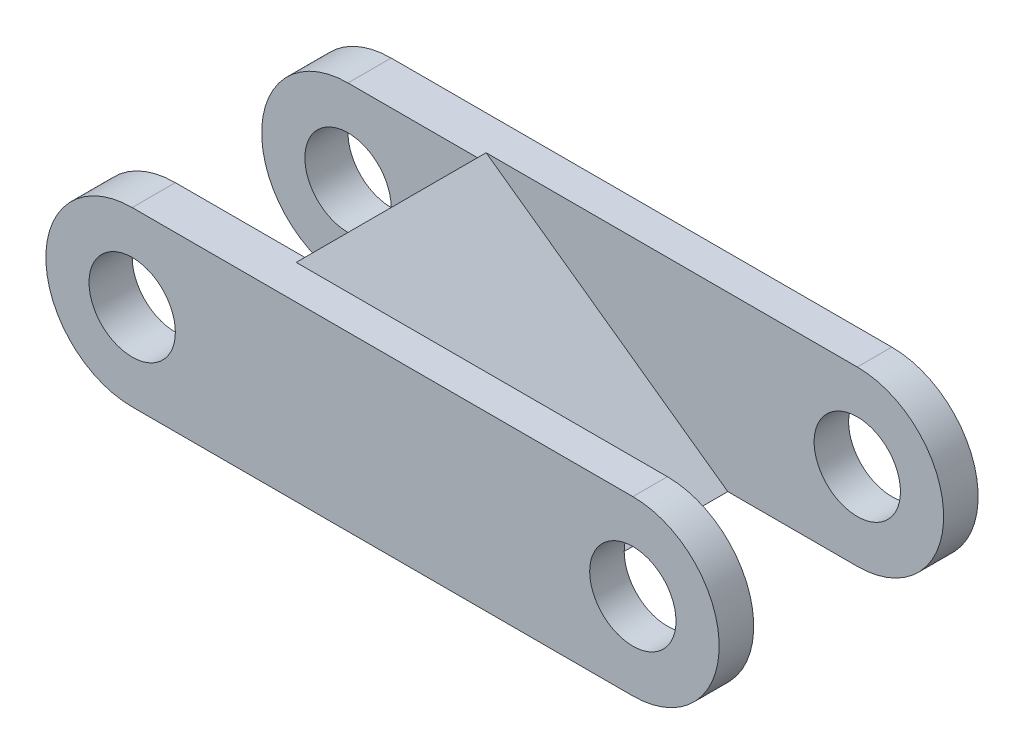
ISO-10303-21;
HEADER;
FILE_DESCRIPTION(('STEP AP214'),'2;1');
FILE_NAME('part.step','',(''),(''),'','','');
FILE_SCHEMA(('AUTOMOTIVE_DESIGN { 1 0 10303 214 1 1 1 1 }'));
ENDSEC;
DATA;
#1=APPLICATION_CONTEXT('core data for automotive mechanical design processes');
#2=APPLICATION_PROTOCOL_DEFINITION('international standard','automotive_design',2000,#1);
#3=PRODUCT_CONTEXT('',#1,'mechanical');
#4=PRODUCT('Part','Part','',(#3));
#5=PRODUCT_RELATED_PRODUCT_CATEGORY('part','',(#4));
#6=PRODUCT_DEFINITION_FORMATION('','',#4);
#7=PRODUCT_DEFINITION_CONTEXT('part definition',#1,'design');
#8=PRODUCT_DEFINITION('design','',#6,#7);
#9=PRODUCT_DEFINITION_SHAPE('','',#8);
#10=(LENGTH_UNIT() NAMED_UNIT(*) SI_UNIT(.MILLI.,.METRE.));
#11=(NAMED_UNIT(*) PLANE_ANGLE_UNIT() SI_UNIT($,.RADIAN.));
#12=(NAMED_UNIT(*) SI_UNIT($,.STERADIAN.) SOLID_ANGLE_UNIT());
#13=UNCERTAINTY_MEASURE_WITH_UNIT(LENGTH_MEASURE(1.E-05),#10,'distance_accuracy_value','');
#14=(GEOMETRIC_REPRESENTATION_CONTEXT(3) GLOBAL_UNCERTAINTY_ASSIGNED_CONTEXT((#13)) GLOBAL_UNIT_ASSIGNED_CONTEXT((#10,
#11,#12)) REPRESENTATION_CONTEXT('',''));
#15=CARTESIAN_POINT('',(0.,0.,0.));
#16=DIRECTION('',(0.,0.,1.));
#17=DIRECTION('',(1.,0.,0.));
#18=AXIS2_PLACEMENT_3D('',#15,#16,#17);
#19=CARTESIAN_POINT('',(0.,10.,-30.));
#20=DIRECTION('',(0.,-1.,0.));
#21=DIRECTION('',(0.,0.,1.));
#22=AXIS2_PLACEMENT_3D('',#19,#20,#21);
#23=PLANE('',#22);
#24=DIRECTION('',(0.,0.,-1.));
#25=VECTOR('',#24,1.);
#26=CARTESIAN_POINT('',(15.,10.,30.404313133584));
#27=LINE('',#26,#25);
#28=CARTESIAN_POINT('',(15.,10.,-4.));
#29=VERTEX_POINT('',#28);
#30=CARTESIAN_POINT('',(15.,10.,-5.));
#31=VERTEX_POINT('',#30);
#32=EDGE_CURVE('E166',#29,#31,#27,.T.);
#33=ORIENTED_EDGE('',*,*,#32,.T.);
#34=DIRECTION('',(-1.,0.,0.));
#35=VECTOR('',#34,1.);
#36=CARTESIAN_POINT('',(15.,10.,-5.));
#37=LINE('',#36,#35);
#38=CARTESIAN_POINT('',(0.,10.,-5.));
#39=VERTEX_POINT('',#38);
#40=EDGE_CURVE('E237',#31,#39,#37,.T.);
#41=ORIENTED_EDGE('',*,*,#40,.T.);
#42=DIRECTION('',(0.,0.,1.));
#43=VECTOR('',#42,1.);
#44=CARTESIAN_POINT('',(0.,10.,-30.));
#45=LINE('',#44,#43);
#46=CARTESIAN_POINT('',(0.,10.,0.));
#47=VERTEX_POINT('',#46);
#48=EDGE_CURVE('E203',#39,#47,#45,.T.);
#49=ORIENTED_EDGE('',*,*,#48,.T.);
#50=DIRECTION('',(-1.,0.,0.));
#51=VECTOR('',#50,1.);
#52=CARTESIAN_POINT('',(0.,10.,0.));
#53=LINE('',#52,#51);
#54=CARTESIAN_POINT('',(57.9938700824609,10.,0.));
#55=VERTEX_POINT('',#54);
#56=EDGE_CURVE('E197',#55,#47,#53,.T.);
#57=ORIENTED_EDGE('',*,*,#56,.F.);
#58=DIRECTION('',(0.,0.,1.));
#59=VECTOR('',#58,1.);
#60=CARTESIAN_POINT('',(57.9938700824609,10.,-30.));
#61=LINE('',#60,#59);
#62=CARTESIAN_POINT('',(57.9938700824609,10.,-4.));
#63=VERTEX_POINT('',#62);
#64=EDGE_CURVE('E212',#63,#55,#61,.T.);
#65=ORIENTED_EDGE('',*,*,#64,.F.);
#66=DIRECTION('',(-1.,0.,0.));
#67=VECTOR('',#66,1.);
#68=CARTESIAN_POINT('',(42.9938700824609,10.,-4.));
#69=LINE('',#68,#67);
#70=EDGE_CURVE('E156',#63,#29,#69,.T.);
#71=ORIENTED_EDGE('',*,*,#70,.T.);
#72=EDGE_LOOP('',(#33,#41,#49,#57,#65,#71));
#73=FACE_BOUND('',#72,.T.);
#74=ADVANCED_FACE('F37',(#73),#23,.F.);
#75=CARTESIAN_POINT('',(0.,0.,-30.));
#76=DIRECTION('',(0.,0.,1.));
#77=DIRECTION('',(-1.,0.,0.));
#78=AXIS2_PLACEMENT_3D('',#75,#76,#77);
#79=CYLINDRICAL_SURFACE('',#78,10.);
#80=CARTESIAN_POINT('',(0.,10.,-30.));
#81=VERTEX_POINT('',#80);
#82=CARTESIAN_POINT('',(0.,10.,-25.));
#83=VERTEX_POINT('',#82);
#84=EDGE_CURVE('E210',#81,#83,#45,.T.);
#85=ORIENTED_EDGE('',*,*,#84,.F.);
#86=CARTESIAN_POINT('',(0.,0.,-30.));
#87=DIRECTION('',(0.,0.,1.));
#88=DIRECTION('',(1.,0.,0.));
#89=AXIS2_PLACEMENT_3D('',#86,#87,#88);
#90=CIRCLE('',#89,10.);
#91=CARTESIAN_POINT('',(0.,-10.,-30.));
#92=VERTEX_POINT('',#91);
#93=EDGE_CURVE('E194',#81,#92,#90,.T.);
#94=ORIENTED_EDGE('',*,*,#93,.T.);
#95=DIRECTION('',(0.,0.,1.));
#96=VECTOR('',#95,1.);
#97=CARTESIAN_POINT('',(0.,-10.,-30.));
#98=LINE('',#97,#96);
#99=CARTESIAN_POINT('',(0.,-10.,-25.));
#100=VERTEX_POINT('',#99);
#101=EDGE_CURVE('E11',#92,#100,#98,.T.);
#102=ORIENTED_EDGE('',*,*,#101,.T.);
#103=CARTESIAN_POINT('',(0.,0.,-25.));
#104=DIRECTION('',(0.,0.,1.));
#105=DIRECTION('',(1.,0.,0.));
#106=AXIS2_PLACEMENT_3D('',#103,#104,#105);
#107=CIRCLE('',#106,10.);
#108=EDGE_CURVE('E179',#83,#100,#107,.T.);
#109=ORIENTED_EDGE('',*,*,#108,.F.);
#110=EDGE_LOOP('',(#85,#94,#102,#109));
#111=FACE_BOUND('',#110,.T.);
#112=ADVANCED_FACE('F270',(#111),#79,.T.);
#113=CARTESIAN_POINT('',(57.9938700824609,0.,-30.));
#114=DIRECTION('',(0.,0.,1.));
#115=DIRECTION('',(-1.,0.,0.));
#116=AXIS2_PLACEMENT_3D('',#113,#114,#115);
#117=CYLINDRICAL_SURFACE('',#116,10.);
#118=ORIENTED_EDGE('',*,*,#64,.T.);
#119=CARTESIAN_POINT('',(57.9938700824609,0.,0.));
#120=DIRECTION('',(0.,0.,1.));
#121=DIRECTION('',(1.,0.,0.));
#122=AXIS2_PLACEMENT_3D('',#119,#120,#121);
#123=CIRCLE('',#122,10.);
#124=CARTESIAN_POINT('',(57.9938700824609,-10.,0.));
#125=VERTEX_POINT('',#124);
#126=EDGE_CURVE('E207',#125,#55,#123,.T.);
#127=ORIENTED_EDGE('',*,*,#126,.F.);
#128=DIRECTION('',(0.,0.,1.));
#129=VECTOR('',#128,1.);
#130=CARTESIAN_POINT('',(57.9938700824609,-10.,-30.));
#131=LINE('',#130,#129);
#132=CARTESIAN_POINT('',(57.9938700824609,-10.,-4.));
#133=VERTEX_POINT('',#132);
#134=EDGE_CURVE('E216',#133,#125,#131,.T.);
#135=ORIENTED_EDGE('',*,*,#134,.F.);
#136=CARTESIAN_POINT('',(57.9938700824609,0.,-4.));
#137=DIRECTION('',(0.,0.,-1.));
#138=DIRECTION('',(-1.,0.,0.));
#139=AXIS2_PLACEMENT_3D('',#136,#137,#138);
#140=CIRCLE('',#139,10.);
#141=EDGE_CURVE('E173',#63,#133,#140,.T.);
#142=ORIENTED_EDGE('',*,*,#141,.F.);
#143=EDGE_LOOP('',(#118,#127,#135,#142));
#144=FACE_BOUND('',#143,.T.);
#145=ADVANCED_FACE('F283',(#144),#117,.T.);
#146=CARTESIAN_POINT('',(0.,0.,-30.));
#147=DIRECTION('',(0.,0.,1.));
#148=DIRECTION('',(-1.,0.,0.));
#149=AXIS2_PLACEMENT_3D('',#146,#147,#148);
#150=CYLINDRICAL_SURFACE('',#149,5.);
#151=CARTESIAN_POINT('',(0.,0.,-25.));
#152=DIRECTION('',(0.,0.,1.));
#153=DIRECTION('',(1.,0.,0.));
#154=AXIS2_PLACEMENT_3D('',#151,#152,#153);
#155=CIRCLE('',#154,5.);
#156=CARTESIAN_POINT('',(5.,0.,-25.));
#157=VERTEX_POINT('',#156);
#158=EDGE_CURVE('E41',#157,#157,#155,.T.);
#159=ORIENTED_EDGE('',*,*,#158,.T.);
#160=EDGE_LOOP('',(#159));
#161=FACE_BOUND('',#160,.T.);
#162=CARTESIAN_POINT('',(0.,0.,-30.));
#163=DIRECTION('',(0.,0.,1.));
#164=DIRECTION('',(1.,0.,0.));
#165=AXIS2_PLACEMENT_3D('',#162,#163,#164);
#166=CIRCLE('',#165,5.);
#167=CARTESIAN_POINT('',(5.,0.,-30.));
#168=VERTEX_POINT('',#167);
#169=EDGE_CURVE('E189',#168,#168,#166,.T.);
#170=ORIENTED_EDGE('',*,*,#169,.F.);
#171=EDGE_LOOP('',(#170));
#172=FACE_BOUND('',#171,.T.);
#173=ADVANCED_FACE('F294',(#161,#172),#150,.F.);
#174=CARTESIAN_POINT('',(57.9938700824609,0.,-30.));
#175=DIRECTION('',(0.,0.,1.));
#176=DIRECTION('',(-1.,0.,0.));
#177=AXIS2_PLACEMENT_3D('',#174,#175,#176);
#178=CYLINDRICAL_SURFACE('',#177,5.);
#179=CARTESIAN_POINT('',(57.9938700824609,0.,-4.));
#180=DIRECTION('',(0.,0.,-1.));
#181=DIRECTION('',(-1.,0.,0.));
#182=AXIS2_PLACEMENT_3D('',#179,#180,#181);
#183=CIRCLE('',#182,5.);
#184=CARTESIAN_POINT('',(52.9938700824609,0.,-4.));
#185=VERTEX_POINT('',#184);
#186=EDGE_CURVE('E171',#185,#185,#183,.T.);
#187=ORIENTED_EDGE('',*,*,#186,.T.);
#188=EDGE_LOOP('',(#187));
#189=FACE_BOUND('',#188,.T.);
#190=CARTESIAN_POINT('',(57.9938700824609,0.,0.));
#191=DIRECTION('',(0.,0.,1.));
#192=DIRECTION('',(1.,0.,0.));
#193=AXIS2_PLACEMENT_3D('',#190,#191,#192);
#194=CIRCLE('',#193,5.);
#195=CARTESIAN_POINT('',(62.9938700824609,0.,0.));
#196=VERTEX_POINT('',#195);
#197=EDGE_CURVE('E182',#196,#196,#194,.T.);
#198=ORIENTED_EDGE('',*,*,#197,.T.);
#199=EDGE_LOOP('',(#198));
#200=FACE_BOUND('',#199,.T.);
#201=ADVANCED_FACE('F304',(#189,#200),#178,.F.);
#202=CARTESIAN_POINT('',(0.,0.,-30.));
#203=DIRECTION('',(0.,0.,-1.));
#204=DIRECTION('',(1.,0.,0.));
#205=AXIS2_PLACEMENT_3D('',#202,#203,#204);
#206=PLANE('',#205);
#207=ORIENTED_EDGE('',*,*,#169,.T.);
#208=EDGE_LOOP('',(#207));
#209=FACE_BOUND('',#208,.T.);
#210=ORIENTED_EDGE('',*,*,#93,.F.);
#211=DIRECTION('',(-1.,0.,0.));
#212=VECTOR('',#211,1.);
#213=CARTESIAN_POINT('',(0.,10.,-30.));
#214=LINE('',#213,#212);
#215=CARTESIAN_POINT('',(57.9938700824609,10.,-30.));
#216=VERTEX_POINT('',#215);
#217=EDGE_CURVE('E63',#216,#81,#214,.T.);
#218=ORIENTED_EDGE('',*,*,#217,.F.);
#219=CARTESIAN_POINT('',(57.9938700824609,0.,-30.));
#220=DIRECTION('',(0.,0.,1.));
#221=DIRECTION('',(1.,0.,0.));
#222=AXIS2_PLACEMENT_3D('',#219,#220,#221);
#223=CIRCLE('',#222,10.);
#224=CARTESIAN_POINT('',(57.9938700824609,-10.,-30.));
#225=VERTEX_POINT('',#224);
#226=EDGE_CURVE('E199',#225,#216,#223,.T.);
#227=ORIENTED_EDGE('',*,*,#226,.F.);
#228=DIRECTION('',(1.,0.,0.));
#229=VECTOR('',#228,1.);
#230=CARTESIAN_POINT('',(0.,-10.,-30.));
#231=LINE('',#230,#229);
#232=EDGE_CURVE('E91',#92,#225,#231,.T.);
#233=ORIENTED_EDGE('',*,*,#232,.F.);
#234=EDGE_LOOP('',(#210,#218,#227,#233));
#235=FACE_BOUND('',#234,.T.);
#236=CARTESIAN_POINT('',(57.9938700824609,0.,-30.));
#237=DIRECTION('',(0.,0.,1.));
#238=DIRECTION('',(1.,0.,0.));
#239=AXIS2_PLACEMENT_3D('',#236,#237,#238);
#240=CIRCLE('',#239,5.);
#241=CARTESIAN_POINT('',(62.9938700824609,0.,-30.));
#242=VERTEX_POINT('',#241);
#243=EDGE_CURVE('E183',#242,#242,#240,.T.);
#244=ORIENTED_EDGE('',*,*,#243,.T.);
#245=EDGE_LOOP('',(#244));
#246=FACE_BOUND('',#245,.T.);
#247=ADVANCED_FACE('F330',(#209,#235,#246),#206,.T.);
#248=CARTESIAN_POINT('',(0.,0.,0.));
#249=DIRECTION('',(0.,0.,-1.));
#250=DIRECTION('',(1.,0.,0.));
#251=AXIS2_PLACEMENT_3D('',#248,#249,#250);
#252=PLANE('',#251);
#253=CARTESIAN_POINT('',(0.,0.,0.));
#254=DIRECTION('',(0.,0.,1.));
#255=DIRECTION('',(1.,0.,0.));
#256=AXIS2_PLACEMENT_3D('',#253,#254,#255);
#257=CIRCLE('',#256,10.);
#258=CARTESIAN_POINT('',(0.,-10.,0.));
#259=VERTEX_POINT('',#258);
#260=EDGE_CURVE('E84',#47,#259,#257,.T.);
#261=ORIENTED_EDGE('',*,*,#260,.T.);
#262=DIRECTION('',(1.,0.,0.));
#263=VECTOR('',#262,1.);
#264=CARTESIAN_POINT('',(0.,-10.,0.));
#265=LINE('',#264,#263);
#266=EDGE_CURVE('E205',#259,#125,#265,.T.);
#267=ORIENTED_EDGE('',*,*,#266,.T.);
#268=ORIENTED_EDGE('',*,*,#126,.T.);
#269=ORIENTED_EDGE('',*,*,#56,.T.);
#270=EDGE_LOOP('',(#261,#267,#268,#269));
#271=FACE_BOUND('',#270,.T.);
#272=CARTESIAN_POINT('',(0.,0.,0.));
#273=DIRECTION('',(0.,0.,1.));
#274=DIRECTION('',(1.,0.,0.));
#275=AXIS2_PLACEMENT_3D('',#272,#273,#274);
#276=CIRCLE('',#275,5.);
#277=CARTESIAN_POINT('',(5.,0.,0.));
#278=VERTEX_POINT('',#277);
#279=EDGE_CURVE('E186',#278,#278,#276,.T.);
#280=ORIENTED_EDGE('',*,*,#279,.F.);
#281=EDGE_LOOP('',(#280));
#282=FACE_BOUND('',#281,.T.);
#283=ORIENTED_EDGE('',*,*,#197,.F.);
#284=EDGE_LOOP('',(#283));
#285=FACE_BOUND('',#284,.T.);
#286=ADVANCED_FACE('F312',(#271,#282,#285),#252,.F.);
#287=CARTESIAN_POINT('',(0.,0.,-5.));
#288=DIRECTION('',(0.,0.,-1.));
#289=DIRECTION('',(-1.,0.,0.));
#290=AXIS2_PLACEMENT_3D('',#287,#288,#289);
#291=CIRCLE('',#290,10.);
#292=CARTESIAN_POINT('',(0.,-10.,-5.));
#293=VERTEX_POINT('',#292);
#294=EDGE_CURVE('E177',#293,#39,#291,.T.);
#295=ORIENTED_EDGE('',*,*,#294,.F.);
#296=EDGE_CURVE('E46',#293,#259,#98,.T.);
#297=ORIENTED_EDGE('',*,*,#296,.T.);
#298=ORIENTED_EDGE('',*,*,#260,.F.);
#299=ORIENTED_EDGE('',*,*,#48,.F.);
#300=EDGE_LOOP('',(#295,#297,#298,#299));
#301=FACE_BOUND('',#300,.T.);
#302=ADVANCED_FACE('F39',(#301),#79,.T.);
#303=CARTESIAN_POINT('',(0.,-10.,-30.));
#304=DIRECTION('',(0.,1.,0.));
#305=DIRECTION('',(0.,0.,-1.));
#306=AXIS2_PLACEMENT_3D('',#303,#304,#305);
#307=PLANE('',#306);
#308=ORIENTED_EDGE('',*,*,#101,.F.);
#309=ORIENTED_EDGE('',*,*,#232,.T.);
#310=CARTESIAN_POINT('',(57.9938700824609,-10.,-26.));
#311=VERTEX_POINT('',#310);
#312=EDGE_CURVE('E159',#225,#311,#131,.T.);
#313=ORIENTED_EDGE('',*,*,#312,.T.);
#314=DIRECTION('',(1.,0.,0.));
#315=VECTOR('',#314,1.);
#316=CARTESIAN_POINT('',(42.9938700824609,-10.,-26.));
#317=LINE('',#316,#315);
#318=CARTESIAN_POINT('',(42.9938700824609,-10.,-26.));
#319=VERTEX_POINT('',#318);
#320=EDGE_CURVE('E145',#319,#311,#317,.T.);
#321=ORIENTED_EDGE('',*,*,#320,.F.);
#322=DIRECTION('',(0.,0.,-1.));
#323=VECTOR('',#322,1.);
#324=CARTESIAN_POINT('',(42.9938700824609,-10.,-26.));
#325=LINE('',#324,#323);
#326=CARTESIAN_POINT('',(42.9938700824609,-10.,-4.));
#327=VERTEX_POINT('',#326);
#328=EDGE_CURVE('E152',#327,#319,#325,.T.);
#329=ORIENTED_EDGE('',*,*,#328,.F.);
#330=DIRECTION('',(-1.,0.,0.));
#331=VECTOR('',#330,1.);
#332=CARTESIAN_POINT('',(42.9938700824609,-10.,-4.));
#333=LINE('',#332,#331);
#334=EDGE_CURVE('E160',#133,#327,#333,.T.);
#335=ORIENTED_EDGE('',*,*,#334,.F.);
#336=ORIENTED_EDGE('',*,*,#134,.T.);
#337=ORIENTED_EDGE('',*,*,#266,.F.);
#338=ORIENTED_EDGE('',*,*,#296,.F.);
#339=DIRECTION('',(-1.,0.,0.));
#340=VECTOR('',#339,1.);
#341=CARTESIAN_POINT('',(15.,-10.,-5.));
#342=LINE('',#341,#340);
#343=CARTESIAN_POINT('',(15.,-10.,-5.));
#344=VERTEX_POINT('',#343);
#345=EDGE_CURVE('E240',#344,#293,#342,.T.);
#346=ORIENTED_EDGE('',*,*,#345,.F.);
#347=DIRECTION('',(0.,0.,1.));
#348=VECTOR('',#347,1.);
#349=CARTESIAN_POINT('',(15.,-10.,-5.));
#350=LINE('',#349,#348);
#351=CARTESIAN_POINT('',(15.,-10.,-25.));
#352=VERTEX_POINT('',#351);
#353=EDGE_CURVE('E248',#352,#344,#350,.T.);
#354=ORIENTED_EDGE('',*,*,#353,.F.);
#355=DIRECTION('',(1.,0.,0.));
#356=VECTOR('',#355,1.);
#357=CARTESIAN_POINT('',(15.,-10.,-25.));
#358=LINE('',#357,#356);
#359=EDGE_CURVE('E255',#100,#352,#358,.T.);
#360=ORIENTED_EDGE('',*,*,#359,.F.);
#361=EDGE_LOOP('',(#308,#309,#313,#321,#329,#335,#336,#337,#338,#346,#354,#360));
#362=FACE_BOUND('',#361,.T.);
#363=ADVANCED_FACE('F158',(#362),#307,.F.);
#364=CARTESIAN_POINT('',(57.9938700824609,0.,-26.));
#365=DIRECTION('',(0.,0.,1.));
#366=DIRECTION('',(1.,0.,0.));
#367=AXIS2_PLACEMENT_3D('',#364,#365,#366);
#368=CIRCLE('',#367,10.);
#369=CARTESIAN_POINT('',(57.9938700824609,10.,-26.));
#370=VERTEX_POINT('',#369);
#371=EDGE_CURVE('E169',#311,#370,#368,.T.);
#372=ORIENTED_EDGE('',*,*,#371,.F.);
#373=ORIENTED_EDGE('',*,*,#312,.F.);
#374=ORIENTED_EDGE('',*,*,#226,.T.);
#375=EDGE_CURVE('E213',#216,#370,#61,.T.);
#376=ORIENTED_EDGE('',*,*,#375,.T.);
#377=EDGE_LOOP('',(#372,#373,#374,#376));
#378=FACE_BOUND('',#377,.T.);
#379=ADVANCED_FACE('F287',(#378),#117,.T.);
#380=DIRECTION('',(1.,0.,0.));
#381=VECTOR('',#380,1.);
#382=CARTESIAN_POINT('',(42.9938700824609,10.,-26.));
#383=LINE('',#382,#381);
#384=CARTESIAN_POINT('',(15.,10.,-26.));
#385=VERTEX_POINT('',#384);
#386=EDGE_CURVE('E147',#385,#370,#383,.T.);
#387=ORIENTED_EDGE('',*,*,#386,.T.);
#388=ORIENTED_EDGE('',*,*,#375,.F.);
#389=ORIENTED_EDGE('',*,*,#217,.T.);
#390=ORIENTED_EDGE('',*,*,#84,.T.);
#391=DIRECTION('',(1.,0.,0.));
#392=VECTOR('',#391,1.);
#393=CARTESIAN_POINT('',(15.,10.,-25.));
#394=LINE('',#393,#392);
#395=CARTESIAN_POINT('',(15.,10.,-25.));
#396=VERTEX_POINT('',#395);
#397=EDGE_CURVE('E245',#83,#396,#394,.T.);
#398=ORIENTED_EDGE('',*,*,#397,.T.);
#399=EDGE_CURVE('E265',#396,#385,#27,.T.);
#400=ORIENTED_EDGE('',*,*,#399,.T.);
#401=EDGE_LOOP('',(#387,#388,#389,#390,#398,#400));
#402=FACE_BOUND('',#401,.T.);
#403=ADVANCED_FACE('F266',(#402),#23,.F.);
#404=CARTESIAN_POINT('',(0.,0.,-5.));
#405=DIRECTION('',(0.,0.,-1.));
#406=DIRECTION('',(-1.,0.,0.));
#407=AXIS2_PLACEMENT_3D('',#404,#405,#406);
#408=CIRCLE('',#407,5.);
#409=CARTESIAN_POINT('',(-5.,0.,-5.));
#410=VERTEX_POINT('',#409);
#411=EDGE_CURVE('E176',#410,#410,#408,.T.);
#412=ORIENTED_EDGE('',*,*,#411,.T.);
#413=EDGE_LOOP('',(#412));
#414=FACE_BOUND('',#413,.T.);
#415=ORIENTED_EDGE('',*,*,#279,.T.);
#416=EDGE_LOOP('',(#415));
#417=FACE_BOUND('',#416,.T.);
#418=ADVANCED_FACE('F225',(#414,#417),#150,.F.);
#419=CARTESIAN_POINT('',(57.9938700824609,0.,-26.));
#420=DIRECTION('',(0.,0.,1.));
#421=DIRECTION('',(1.,0.,0.));
#422=AXIS2_PLACEMENT_3D('',#419,#420,#421);
#423=CIRCLE('',#422,5.);
#424=CARTESIAN_POINT('',(62.9938700824609,0.,-26.));
#425=VERTEX_POINT('',#424);
#426=EDGE_CURVE('E172',#425,#425,#423,.T.);
#427=ORIENTED_EDGE('',*,*,#426,.T.);
#428=EDGE_LOOP('',(#427));
#429=FACE_BOUND('',#428,.T.);
#430=ORIENTED_EDGE('',*,*,#243,.F.);
#431=EDGE_LOOP('',(#430));
#432=FACE_BOUND('',#431,.T.);
#433=ADVANCED_FACE('F292',(#429,#432),#178,.F.);
#434=CARTESIAN_POINT('',(42.9938700824609,-10.,-4.));
#435=DIRECTION('',(0.,0.,1.));
#436=DIRECTION('',(-1.,0.,0.));
#437=AXIS2_PLACEMENT_3D('',#434,#435,#436);
#438=PLANE('',#437);
#439=ORIENTED_EDGE('',*,*,#186,.F.);
#440=EDGE_LOOP('',(#439));
#441=FACE_BOUND('',#440,.T.);
#442=ORIENTED_EDGE('',*,*,#70,.F.);
#443=ORIENTED_EDGE('',*,*,#141,.T.);
#444=ORIENTED_EDGE('',*,*,#334,.T.);
#445=DIRECTION('',(0.813673273283126,-0.581322461586273,0.));
#446=VECTOR('',#445,1.);
#447=CARTESIAN_POINT('',(15.,10.,-4.));
#448=LINE('',#447,#446);
#449=EDGE_CURVE('E149',#29,#327,#448,.T.);
#450=ORIENTED_EDGE('',*,*,#449,.F.);
#451=EDGE_LOOP('',(#442,#443,#444,#450));
#452=FACE_BOUND('',#451,.T.);
#453=ADVANCED_FACE('F317',(#441,#452),#438,.F.);
#454=CARTESIAN_POINT('',(42.9938700824609,-10.,-26.));
#455=DIRECTION('',(0.,0.,-1.));
#456=DIRECTION('',(1.,0.,0.));
#457=AXIS2_PLACEMENT_3D('',#454,#455,#456);
#458=PLANE('',#457);
#459=ORIENTED_EDGE('',*,*,#426,.F.);
#460=EDGE_LOOP('',(#459));
#461=FACE_BOUND('',#460,.T.);
#462=ORIENTED_EDGE('',*,*,#371,.T.);
#463=ORIENTED_EDGE('',*,*,#386,.F.);
#464=DIRECTION('',(0.813673273283126,-0.581322461586273,0.));
#465=VECTOR('',#464,1.);
#466=CARTESIAN_POINT('',(15.,10.,-26.));
#467=LINE('',#466,#465);
#468=EDGE_CURVE('E140',#385,#319,#467,.T.);
#469=ORIENTED_EDGE('',*,*,#468,.T.);
#470=ORIENTED_EDGE('',*,*,#320,.T.);
#471=EDGE_LOOP('',(#462,#463,#469,#470));
#472=FACE_BOUND('',#471,.T.);
#473=ADVANCED_FACE('F143',(#461,#472),#458,.F.);
#474=CARTESIAN_POINT('',(15.,-10.,-25.));
#475=DIRECTION('',(0.,0.,-1.));
#476=DIRECTION('',(1.,0.,0.));
#477=AXIS2_PLACEMENT_3D('',#474,#475,#476);
#478=PLANE('',#477);
#479=ORIENTED_EDGE('',*,*,#158,.F.);
#480=EDGE_LOOP('',(#479));
#481=FACE_BOUND('',#480,.T.);
#482=ORIENTED_EDGE('',*,*,#397,.F.);
#483=ORIENTED_EDGE('',*,*,#108,.T.);
#484=ORIENTED_EDGE('',*,*,#359,.T.);
#485=DIRECTION('',(0.,1.,0.));
#486=VECTOR('',#485,1.);
#487=CARTESIAN_POINT('',(15.,-10.,-25.));
#488=LINE('',#487,#486);
#489=EDGE_CURVE('E220',#352,#396,#488,.T.);
#490=ORIENTED_EDGE('',*,*,#489,.T.);
#491=EDGE_LOOP('',(#482,#483,#484,#490));
#492=FACE_BOUND('',#491,.T.);
#493=ADVANCED_FACE('F232',(#481,#492),#478,.F.);
#494=CARTESIAN_POINT('',(15.,-10.,-5.));
#495=DIRECTION('',(0.,0.,1.));
#496=DIRECTION('',(-1.,0.,0.));
#497=AXIS2_PLACEMENT_3D('',#494,#495,#496);
#498=PLANE('',#497);
#499=ORIENTED_EDGE('',*,*,#411,.F.);
#500=EDGE_LOOP('',(#499));
#501=FACE_BOUND('',#500,.T.);
#502=ORIENTED_EDGE('',*,*,#294,.T.);
#503=ORIENTED_EDGE('',*,*,#40,.F.);
#504=DIRECTION('',(0.,1.,0.));
#505=VECTOR('',#504,1.);
#506=CARTESIAN_POINT('',(15.,-10.,-5.));
#507=LINE('',#506,#505);
#508=EDGE_CURVE('E254',#344,#31,#507,.T.);
#509=ORIENTED_EDGE('',*,*,#508,.F.);
#510=ORIENTED_EDGE('',*,*,#345,.T.);
#511=EDGE_LOOP('',(#502,#503,#509,#510));
#512=FACE_BOUND('',#511,.T.);
#513=ADVANCED_FACE('F228',(#501,#512),#498,.F.);
#514=CARTESIAN_POINT('',(15.,-10.,-5.));
#515=DIRECTION('',(1.,0.,0.));
#516=DIRECTION('',(0.,0.,1.));
#517=AXIS2_PLACEMENT_3D('',#514,#515,#516);
#518=PLANE('',#517);
#519=DIRECTION('',(0.,0.,1.));
#520=VECTOR('',#519,1.);
#521=CARTESIAN_POINT('',(15.,10.,-5.));
#522=LINE('',#521,#520);
#523=EDGE_CURVE('E54',#396,#31,#522,.T.);
#524=ORIENTED_EDGE('',*,*,#523,.F.);
#525=ORIENTED_EDGE('',*,*,#489,.F.);
#526=ORIENTED_EDGE('',*,*,#353,.T.);
#527=ORIENTED_EDGE('',*,*,#508,.T.);
#528=EDGE_LOOP('',(#524,#525,#526,#527));
#529=FACE_BOUND('',#528,.T.);
#530=ADVANCED_FACE('F231',(#529),#518,.F.);
#531=CARTESIAN_POINT('',(42.9938700824609,-10.,-59.404313133584));
#532=DIRECTION('',(0.581322461586273,0.813673273283126,0.));
#533=DIRECTION('',(-0.813673273283126,0.581322461586273,0.));
#534=AXIS2_PLACEMENT_3D('',#531,#532,#533);
#535=PLANE('',#534);
#536=ORIENTED_EDGE('',*,*,#523,.T.);
#537=ORIENTED_EDGE('',*,*,#32,.F.);
#538=ORIENTED_EDGE('',*,*,#449,.T.);
#539=ORIENTED_EDGE('',*,*,#328,.T.);
#540=ORIENTED_EDGE('',*,*,#468,.F.);
#541=ORIENTED_EDGE('',*,*,#399,.F.);
#542=EDGE_LOOP('',(#536,#537,#538,#539,#540,#541));
#543=FACE_BOUND('',#542,.T.);
#544=ADVANCED_FACE('F153',(#543),#535,.T.);
#545=CLOSED_SHELL('',(#74,#112,#145,#173,#201,#247,#286,#302,#363,#379,#403,#418,#433,#453,#473,
#493,#513,#530,#544));
#546=MANIFOLD_SOLID_BREP('B2',#545);
#547=ADVANCED_BREP_SHAPE_REPRESENTATION('',(#18,#546),#14);
#548=SHAPE_DEFINITION_REPRESENTATION(#9,#547);
ENDSEC;
END-ISO-10303-21;
